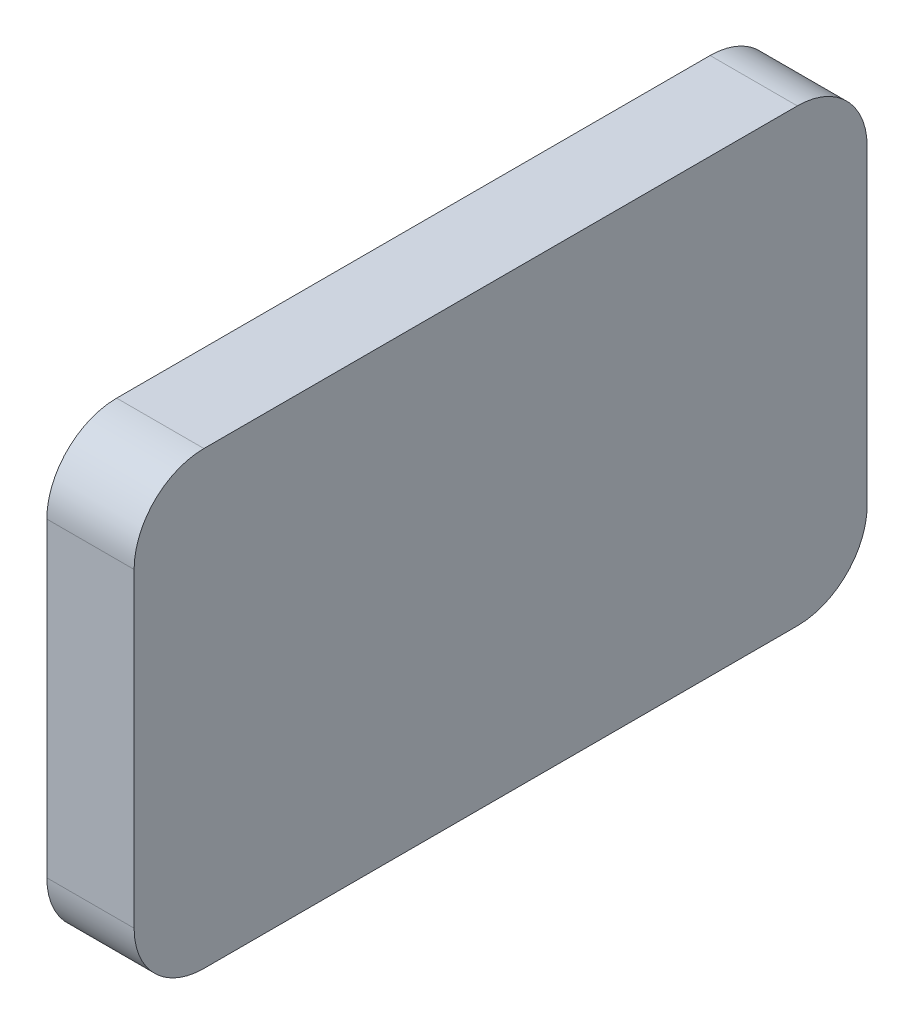
ISO-10303-21;
HEADER;
FILE_DESCRIPTION(('STEP AP214'),'2;1');
FILE_NAME('part.step','',(''),(''),'','','');
FILE_SCHEMA(('AUTOMOTIVE_DESIGN { 1 0 10303 214 1 1 1 1 }'));
ENDSEC;
DATA;
#1=APPLICATION_CONTEXT('core data for automotive mechanical design processes');
#2=APPLICATION_PROTOCOL_DEFINITION('international standard','automotive_design',2000,#1);
#3=PRODUCT_CONTEXT('',#1,'mechanical');
#4=PRODUCT('Part','Part','',(#3));
#5=PRODUCT_RELATED_PRODUCT_CATEGORY('part','',(#4));
#6=PRODUCT_DEFINITION_FORMATION('','',#4);
#7=PRODUCT_DEFINITION_CONTEXT('part definition',#1,'design');
#8=PRODUCT_DEFINITION('design','',#6,#7);
#9=PRODUCT_DEFINITION_SHAPE('','',#8);
#10=(LENGTH_UNIT() NAMED_UNIT(*) SI_UNIT(.MILLI.,.METRE.));
#11=(NAMED_UNIT(*) PLANE_ANGLE_UNIT() SI_UNIT($,.RADIAN.));
#12=(NAMED_UNIT(*) SI_UNIT($,.STERADIAN.) SOLID_ANGLE_UNIT());
#13=UNCERTAINTY_MEASURE_WITH_UNIT(LENGTH_MEASURE(1.E-05),#10,'distance_accuracy_value','');
#14=(GEOMETRIC_REPRESENTATION_CONTEXT(3) GLOBAL_UNCERTAINTY_ASSIGNED_CONTEXT((#13)) GLOBAL_UNIT_ASSIGNED_CONTEXT((#10,
#11,#12)) REPRESENTATION_CONTEXT('',''));
#15=CARTESIAN_POINT('',(0.,0.,0.));
#16=DIRECTION('',(0.,0.,1.));
#17=DIRECTION('',(1.,0.,0.));
#18=AXIS2_PLACEMENT_3D('',#15,#16,#17);
#19=CARTESIAN_POINT('',(0.,0.,0.));
#20=DIRECTION('',(1.,0.,0.));
#21=DIRECTION('',(0.,0.,-1.));
#22=AXIS2_PLACEMENT_3D('',#19,#20,#21);
#23=PLANE('',#22);
#24=CARTESIAN_POINT('',(0.,-0.345,0.4));
#25=DIRECTION('',(-1.,0.,0.));
#26=DIRECTION('',(0.,0.,1.));
#27=AXIS2_PLACEMENT_3D('',#24,#25,#26);
#28=CIRCLE('',#27,0.2);
#29=CARTESIAN_POINT('',(0.,-0.345,0.6));
#30=VERTEX_POINT('',#29);
#31=CARTESIAN_POINT('',(0.,-0.545,0.4));
#32=VERTEX_POINT('',#31);
#33=EDGE_CURVE('E20',#30,#32,#28,.F.);
#34=ORIENTED_EDGE('',*,*,#33,.F.);
#35=DIRECTION('',(0.,1.,0.));
#36=VECTOR('',#35,1.);
#37=CARTESIAN_POINT('',(0.,0.,0.6));
#38=LINE('',#37,#36);
#39=CARTESIAN_POINT('',(0.,0.545,0.6));
#40=VERTEX_POINT('',#39);
#41=EDGE_CURVE('E99',#40,#30,#38,.F.);
#42=ORIENTED_EDGE('',*,*,#41,.F.);
#43=CARTESIAN_POINT('',(0.,0.545,0.4));
#44=DIRECTION('',(-1.,0.,0.));
#45=DIRECTION('',(0.,0.,1.));
#46=AXIS2_PLACEMENT_3D('',#43,#44,#45);
#47=CIRCLE('',#46,0.2);
#48=CARTESIAN_POINT('',(0.,0.745,0.4));
#49=VERTEX_POINT('',#48);
#50=EDGE_CURVE('E107',#49,#40,#47,.F.);
#51=ORIENTED_EDGE('',*,*,#50,.F.);
#52=DIRECTION('',(0.,0.,-1.));
#53=VECTOR('',#52,1.);
#54=CARTESIAN_POINT('',(0.,0.745,0.));
#55=LINE('',#54,#53);
#56=CARTESIAN_POINT('',(0.,0.745,-1.3));
#57=VERTEX_POINT('',#56);
#58=EDGE_CURVE('E110',#49,#57,#55,.T.);
#59=ORIENTED_EDGE('',*,*,#58,.T.);
#60=CARTESIAN_POINT('',(0.,0.545,-1.3));
#61=DIRECTION('',(-1.,0.,0.));
#62=DIRECTION('',(0.,0.,1.));
#63=AXIS2_PLACEMENT_3D('',#60,#61,#62);
#64=CIRCLE('',#63,0.2);
#65=CARTESIAN_POINT('',(0.,0.545,-1.5));
#66=VERTEX_POINT('',#65);
#67=EDGE_CURVE('E114',#66,#57,#64,.F.);
#68=ORIENTED_EDGE('',*,*,#67,.F.);
#69=DIRECTION('',(0.,1.,0.));
#70=VECTOR('',#69,1.);
#71=CARTESIAN_POINT('',(0.,0.,-1.5));
#72=LINE('',#71,#70);
#73=CARTESIAN_POINT('',(0.,-0.345,-1.5));
#74=VERTEX_POINT('',#73);
#75=EDGE_CURVE('E117',#66,#74,#72,.F.);
#76=ORIENTED_EDGE('',*,*,#75,.T.);
#77=CARTESIAN_POINT('',(0.,-0.345,-1.3));
#78=DIRECTION('',(-1.,0.,0.));
#79=DIRECTION('',(0.,0.,1.));
#80=AXIS2_PLACEMENT_3D('',#77,#78,#79);
#81=CIRCLE('',#80,0.2);
#82=CARTESIAN_POINT('',(0.,-0.545,-1.3));
#83=VERTEX_POINT('',#82);
#84=EDGE_CURVE('E88',#83,#74,#81,.F.);
#85=ORIENTED_EDGE('',*,*,#84,.F.);
#86=DIRECTION('',(0.,0.,-1.));
#87=VECTOR('',#86,1.);
#88=CARTESIAN_POINT('',(0.,-0.545,0.));
#89=LINE('',#88,#87);
#90=EDGE_CURVE('E85',#32,#83,#89,.T.);
#91=ORIENTED_EDGE('',*,*,#90,.F.);
#92=EDGE_LOOP('',(#34,#42,#51,#59,#68,#76,#85,#91));
#93=FACE_BOUND('',#92,.T.);
#94=ADVANCED_FACE('F17',(#93),#23,.F.);
#95=CARTESIAN_POINT('',(0.25,-0.545,0.));
#96=DIRECTION('',(0.,-1.,0.));
#97=DIRECTION('',(0.,0.,-1.));
#98=AXIS2_PLACEMENT_3D('',#95,#96,#97);
#99=PLANE('',#98);
#100=DIRECTION('',(0.,0.,-1.));
#101=VECTOR('',#100,1.);
#102=CARTESIAN_POINT('',(0.25,-0.545,0.));
#103=LINE('',#102,#101);
#104=CARTESIAN_POINT('',(0.25,-0.545,0.4));
#105=VERTEX_POINT('',#104);
#106=CARTESIAN_POINT('',(0.25,-0.545,-1.3));
#107=VERTEX_POINT('',#106);
#108=EDGE_CURVE('E94',#105,#107,#103,.T.);
#109=ORIENTED_EDGE('',*,*,#108,.F.);
#110=DIRECTION('',(-1.,0.,0.));
#111=VECTOR('',#110,1.);
#112=CARTESIAN_POINT('',(0.25,-0.545,0.4));
#113=LINE('',#112,#111);
#114=EDGE_CURVE('E84',#32,#105,#113,.F.);
#115=ORIENTED_EDGE('',*,*,#114,.F.);
#116=ORIENTED_EDGE('',*,*,#90,.T.);
#117=DIRECTION('',(-1.,0.,0.));
#118=VECTOR('',#117,1.);
#119=CARTESIAN_POINT('',(0.25,-0.545,-1.3));
#120=LINE('',#119,#118);
#121=EDGE_CURVE('E118',#107,#83,#120,.T.);
#122=ORIENTED_EDGE('',*,*,#121,.F.);
#123=EDGE_LOOP('',(#109,#115,#116,#122));
#124=FACE_BOUND('',#123,.T.);
#125=ADVANCED_FACE('F92',(#124),#99,.T.);
#126=CARTESIAN_POINT('',(0.25,-0.345,-1.3));
#127=DIRECTION('',(-1.,0.,0.));
#128=DIRECTION('',(0.,0.,1.));
#129=AXIS2_PLACEMENT_3D('',#126,#127,#128);
#130=CYLINDRICAL_SURFACE('',#129,0.2);
#131=CARTESIAN_POINT('',(0.25,-0.345,-1.3));
#132=DIRECTION('',(-1.,0.,0.));
#133=DIRECTION('',(0.,0.,1.));
#134=AXIS2_PLACEMENT_3D('',#131,#132,#133);
#135=CIRCLE('',#134,0.2);
#136=CARTESIAN_POINT('',(0.25,-0.345,-1.5));
#137=VERTEX_POINT('',#136);
#138=EDGE_CURVE('E132',#107,#137,#135,.F.);
#139=ORIENTED_EDGE('',*,*,#138,.F.);
#140=ORIENTED_EDGE('',*,*,#121,.T.);
#141=ORIENTED_EDGE('',*,*,#84,.T.);
#142=DIRECTION('',(1.,0.,0.));
#143=VECTOR('',#142,1.);
#144=CARTESIAN_POINT('',(0.25,-0.345,-1.5));
#145=LINE('',#144,#143);
#146=EDGE_CURVE('E115',#74,#137,#145,.T.);
#147=ORIENTED_EDGE('',*,*,#146,.T.);
#148=EDGE_LOOP('',(#139,#140,#141,#147));
#149=FACE_BOUND('',#148,.T.);
#150=ADVANCED_FACE('F139',(#149),#130,.T.);
#151=CARTESIAN_POINT('',(0.25,0.,-1.5));
#152=DIRECTION('',(0.,0.,1.));
#153=DIRECTION('',(1.,0.,0.));
#154=AXIS2_PLACEMENT_3D('',#151,#152,#153);
#155=PLANE('',#154);
#156=DIRECTION('',(-1.,0.,0.));
#157=VECTOR('',#156,1.);
#158=CARTESIAN_POINT('',(0.25,0.545,-1.5));
#159=LINE('',#158,#157);
#160=CARTESIAN_POINT('',(0.25,0.545,-1.5));
#161=VERTEX_POINT('',#160);
#162=EDGE_CURVE('E111',#161,#66,#159,.T.);
#163=ORIENTED_EDGE('',*,*,#162,.F.);
#164=DIRECTION('',(0.,1.,0.));
#165=VECTOR('',#164,1.);
#166=CARTESIAN_POINT('',(0.25,0.,-1.5));
#167=LINE('',#166,#165);
#168=EDGE_CURVE('E131',#137,#161,#167,.T.);
#169=ORIENTED_EDGE('',*,*,#168,.F.);
#170=ORIENTED_EDGE('',*,*,#146,.F.);
#171=ORIENTED_EDGE('',*,*,#75,.F.);
#172=EDGE_LOOP('',(#163,#169,#170,#171));
#173=FACE_BOUND('',#172,.T.);
#174=ADVANCED_FACE('F144',(#173),#155,.F.);
#175=CARTESIAN_POINT('',(0.25,0.545,-1.3));
#176=DIRECTION('',(-1.,0.,0.));
#177=DIRECTION('',(0.,0.,1.));
#178=AXIS2_PLACEMENT_3D('',#175,#176,#177);
#179=CYLINDRICAL_SURFACE('',#178,0.2);
#180=CARTESIAN_POINT('',(0.25,0.545,-1.3));
#181=DIRECTION('',(-1.,0.,0.));
#182=DIRECTION('',(0.,0.,1.));
#183=AXIS2_PLACEMENT_3D('',#180,#181,#182);
#184=CIRCLE('',#183,0.2);
#185=CARTESIAN_POINT('',(0.25,0.745,-1.3));
#186=VERTEX_POINT('',#185);
#187=EDGE_CURVE('E128',#161,#186,#184,.F.);
#188=ORIENTED_EDGE('',*,*,#187,.F.);
#189=ORIENTED_EDGE('',*,*,#162,.T.);
#190=ORIENTED_EDGE('',*,*,#67,.T.);
#191=DIRECTION('',(1.,0.,0.));
#192=VECTOR('',#191,1.);
#193=CARTESIAN_POINT('',(0.25,0.745,-1.3));
#194=LINE('',#193,#192);
#195=EDGE_CURVE('E108',#57,#186,#194,.T.);
#196=ORIENTED_EDGE('',*,*,#195,.T.);
#197=EDGE_LOOP('',(#188,#189,#190,#196));
#198=FACE_BOUND('',#197,.T.);
#199=ADVANCED_FACE('F203',(#198),#179,.T.);
#200=CARTESIAN_POINT('',(0.25,0.745,0.));
#201=DIRECTION('',(0.,-1.,0.));
#202=DIRECTION('',(0.,0.,-1.));
#203=AXIS2_PLACEMENT_3D('',#200,#201,#202);
#204=PLANE('',#203);
#205=DIRECTION('',(-1.,0.,0.));
#206=VECTOR('',#205,1.);
#207=CARTESIAN_POINT('',(0.25,0.745,0.4));
#208=LINE('',#207,#206);
#209=CARTESIAN_POINT('',(0.25,0.745,0.4));
#210=VERTEX_POINT('',#209);
#211=EDGE_CURVE('E104',#210,#49,#208,.T.);
#212=ORIENTED_EDGE('',*,*,#211,.F.);
#213=DIRECTION('',(0.,0.,-1.));
#214=VECTOR('',#213,1.);
#215=CARTESIAN_POINT('',(0.25,0.745,0.));
#216=LINE('',#215,#214);
#217=EDGE_CURVE('E127',#186,#210,#216,.F.);
#218=ORIENTED_EDGE('',*,*,#217,.F.);
#219=ORIENTED_EDGE('',*,*,#195,.F.);
#220=ORIENTED_EDGE('',*,*,#58,.F.);
#221=EDGE_LOOP('',(#212,#218,#219,#220));
#222=FACE_BOUND('',#221,.T.);
#223=ADVANCED_FACE('F157',(#222),#204,.F.);
#224=CARTESIAN_POINT('',(0.25,0.545,0.4));
#225=DIRECTION('',(-1.,0.,0.));
#226=DIRECTION('',(0.,0.,1.));
#227=AXIS2_PLACEMENT_3D('',#224,#225,#226);
#228=CYLINDRICAL_SURFACE('',#227,0.2);
#229=CARTESIAN_POINT('',(0.25,0.545,0.4));
#230=DIRECTION('',(-1.,0.,0.));
#231=DIRECTION('',(0.,0.,1.));
#232=AXIS2_PLACEMENT_3D('',#229,#230,#231);
#233=CIRCLE('',#232,0.2);
#234=CARTESIAN_POINT('',(0.25,0.545,0.6));
#235=VERTEX_POINT('',#234);
#236=EDGE_CURVE('E124',#210,#235,#233,.F.);
#237=ORIENTED_EDGE('',*,*,#236,.F.);
#238=ORIENTED_EDGE('',*,*,#211,.T.);
#239=ORIENTED_EDGE('',*,*,#50,.T.);
#240=DIRECTION('',(1.,0.,0.));
#241=VECTOR('',#240,1.);
#242=CARTESIAN_POINT('',(0.25,0.545,0.6));
#243=LINE('',#242,#241);
#244=EDGE_CURVE('E95',#235,#40,#243,.F.);
#245=ORIENTED_EDGE('',*,*,#244,.F.);
#246=EDGE_LOOP('',(#237,#238,#239,#245));
#247=FACE_BOUND('',#246,.T.);
#248=ADVANCED_FACE('F160',(#247),#228,.T.);
#249=CARTESIAN_POINT('',(0.25,0.,0.6));
#250=DIRECTION('',(0.,0.,1.));
#251=DIRECTION('',(1.,0.,0.));
#252=AXIS2_PLACEMENT_3D('',#249,#250,#251);
#253=PLANE('',#252);
#254=DIRECTION('',(0.,1.,0.));
#255=VECTOR('',#254,1.);
#256=CARTESIAN_POINT('',(0.25,0.,0.6));
#257=LINE('',#256,#255);
#258=CARTESIAN_POINT('',(0.25,-0.345,0.6));
#259=VERTEX_POINT('',#258);
#260=EDGE_CURVE('E26',#235,#259,#257,.F.);
#261=ORIENTED_EDGE('',*,*,#260,.F.);
#262=ORIENTED_EDGE('',*,*,#244,.T.);
#263=ORIENTED_EDGE('',*,*,#41,.T.);
#264=DIRECTION('',(-1.,0.,0.));
#265=VECTOR('',#264,1.);
#266=CARTESIAN_POINT('',(0.25,-0.345,0.6));
#267=LINE('',#266,#265);
#268=EDGE_CURVE('E35',#259,#30,#267,.T.);
#269=ORIENTED_EDGE('',*,*,#268,.F.);
#270=EDGE_LOOP('',(#261,#262,#263,#269));
#271=FACE_BOUND('',#270,.T.);
#272=ADVANCED_FACE('F161',(#271),#253,.T.);
#273=CARTESIAN_POINT('',(0.25,-0.345,0.4));
#274=DIRECTION('',(-1.,0.,0.));
#275=DIRECTION('',(0.,0.,1.));
#276=AXIS2_PLACEMENT_3D('',#273,#274,#275);
#277=CYLINDRICAL_SURFACE('',#276,0.2);
#278=CARTESIAN_POINT('',(0.25,-0.345,0.4));
#279=DIRECTION('',(-1.,0.,0.));
#280=DIRECTION('',(0.,0.,1.));
#281=AXIS2_PLACEMENT_3D('',#278,#279,#280);
#282=CIRCLE('',#281,0.2);
#283=EDGE_CURVE('E11',#259,#105,#282,.F.);
#284=ORIENTED_EDGE('',*,*,#283,.F.);
#285=ORIENTED_EDGE('',*,*,#268,.T.);
#286=ORIENTED_EDGE('',*,*,#33,.T.);
#287=ORIENTED_EDGE('',*,*,#114,.T.);
#288=EDGE_LOOP('',(#284,#285,#286,#287));
#289=FACE_BOUND('',#288,.T.);
#290=ADVANCED_FACE('F82',(#289),#277,.T.);
#291=CARTESIAN_POINT('',(0.25,0.,0.));
#292=DIRECTION('',(1.,0.,0.));
#293=DIRECTION('',(0.,0.,-1.));
#294=AXIS2_PLACEMENT_3D('',#291,#292,#293);
#295=PLANE('',#294);
#296=ORIENTED_EDGE('',*,*,#260,.T.);
#297=ORIENTED_EDGE('',*,*,#283,.T.);
#298=ORIENTED_EDGE('',*,*,#108,.T.);
#299=ORIENTED_EDGE('',*,*,#138,.T.);
#300=ORIENTED_EDGE('',*,*,#168,.T.);
#301=ORIENTED_EDGE('',*,*,#187,.T.);
#302=ORIENTED_EDGE('',*,*,#217,.T.);
#303=ORIENTED_EDGE('',*,*,#236,.T.);
#304=EDGE_LOOP('',(#296,#297,#298,#299,#300,#301,#302,#303));
#305=FACE_BOUND('',#304,.T.);
#306=ADVANCED_FACE('F149',(#305),#295,.T.);
#307=CLOSED_SHELL('',(#94,#125,#150,#174,#199,#223,#248,#272,#290,#306));
#308=MANIFOLD_SOLID_BREP('B1',#307);
#309=ADVANCED_BREP_SHAPE_REPRESENTATION('',(#18,#308),#14);
#310=SHAPE_DEFINITION_REPRESENTATION(#9,#309);
ENDSEC;
END-ISO-10303-21;
